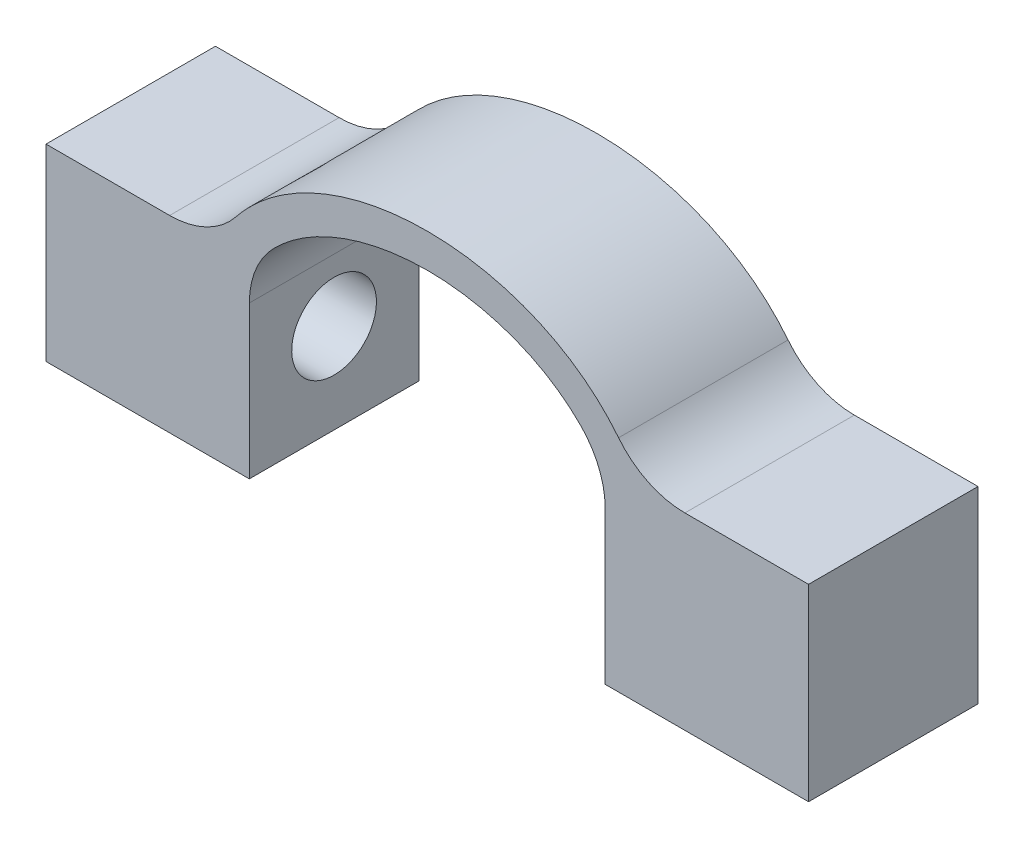
ISO-10303-21;
HEADER;
FILE_DESCRIPTION(('STEP AP214'),'2;1');
FILE_NAME('part.step','',(''),(''),'','','');
FILE_SCHEMA(('AUTOMOTIVE_DESIGN { 1 0 10303 214 1 1 1 1 }'));
ENDSEC;
DATA;
#1=APPLICATION_CONTEXT('core data for automotive mechanical design processes');
#2=APPLICATION_PROTOCOL_DEFINITION('international standard','automotive_design',2000,#1);
#3=PRODUCT_CONTEXT('',#1,'mechanical');
#4=PRODUCT('Part','Part','',(#3));
#5=PRODUCT_RELATED_PRODUCT_CATEGORY('part','',(#4));
#6=PRODUCT_DEFINITION_FORMATION('','',#4);
#7=PRODUCT_DEFINITION_CONTEXT('part definition',#1,'design');
#8=PRODUCT_DEFINITION('design','',#6,#7);
#9=PRODUCT_DEFINITION_SHAPE('','',#8);
#10=(LENGTH_UNIT() NAMED_UNIT(*) SI_UNIT(.MILLI.,.METRE.));
#11=(NAMED_UNIT(*) PLANE_ANGLE_UNIT() SI_UNIT($,.RADIAN.));
#12=(NAMED_UNIT(*) SI_UNIT($,.STERADIAN.) SOLID_ANGLE_UNIT());
#13=UNCERTAINTY_MEASURE_WITH_UNIT(LENGTH_MEASURE(1.E-05),#10,'distance_accuracy_value','');
#14=(GEOMETRIC_REPRESENTATION_CONTEXT(3) GLOBAL_UNCERTAINTY_ASSIGNED_CONTEXT((#13)) GLOBAL_UNIT_ASSIGNED_CONTEXT((#10,
#11,#12)) REPRESENTATION_CONTEXT('',''));
#15=CARTESIAN_POINT('',(0.,0.,0.));
#16=DIRECTION('',(0.,0.,1.));
#17=DIRECTION('',(1.,0.,0.));
#18=AXIS2_PLACEMENT_3D('',#15,#16,#17);
#19=CARTESIAN_POINT('',(0.,0.,-10.));
#20=DIRECTION('',(0.,-1.,0.));
#21=DIRECTION('',(0.,0.,-1.));
#22=AXIS2_PLACEMENT_3D('',#19,#20,#21);
#23=PLANE('',#22);
#24=CARTESIAN_POINT('',(41.5,0.,-5.));
#25=DIRECTION('',(0.,-1.,0.));
#26=DIRECTION('',(0.,0.,-1.));
#27=AXIS2_PLACEMENT_3D('',#24,#25,#26);
#28=CIRCLE('',#27,2.);
#29=CARTESIAN_POINT('',(41.5,0.,-7.));
#30=VERTEX_POINT('',#29);
#31=EDGE_CURVE('E561',#30,#30,#28,.T.);
#32=ORIENTED_EDGE('',*,*,#31,.F.);
#33=EDGE_LOOP('',(#32));
#34=FACE_BOUND('',#33,.T.);
#35=DIRECTION('',(1.,0.,0.));
#36=VECTOR('',#35,1.);
#37=CARTESIAN_POINT('',(0.,0.,0.));
#38=LINE('',#37,#36);
#39=CARTESIAN_POINT('',(33.,0.,0.));
#40=VERTEX_POINT('',#39);
#41=CARTESIAN_POINT('',(45.,0.,0.));
#42=VERTEX_POINT('',#41);
#43=EDGE_CURVE('E166',#40,#42,#38,.T.);
#44=ORIENTED_EDGE('',*,*,#43,.F.);
#45=DIRECTION('',(0.,0.,-1.));
#46=VECTOR('',#45,1.);
#47=CARTESIAN_POINT('',(33.,0.,62.9026152266645));
#48=LINE('',#47,#46);
#49=CARTESIAN_POINT('',(33.,0.,-9.99999999999999));
#50=VERTEX_POINT('',#49);
#51=EDGE_CURVE('E159',#40,#50,#48,.T.);
#52=ORIENTED_EDGE('',*,*,#51,.T.);
#53=DIRECTION('',(1.,0.,0.));
#54=VECTOR('',#53,1.);
#55=CARTESIAN_POINT('',(0.,0.,-10.));
#56=LINE('',#55,#54);
#57=CARTESIAN_POINT('',(45.,0.,-10.));
#58=VERTEX_POINT('',#57);
#59=EDGE_CURVE('E270',#50,#58,#56,.T.);
#60=ORIENTED_EDGE('',*,*,#59,.T.);
#61=DIRECTION('',(0.,0.,1.));
#62=VECTOR('',#61,1.);
#63=CARTESIAN_POINT('',(45.,0.,-10.));
#64=LINE('',#63,#62);
#65=EDGE_CURVE('E191',#58,#42,#64,.T.);
#66=ORIENTED_EDGE('',*,*,#65,.T.);
#67=EDGE_LOOP('',(#44,#52,#60,#66));
#68=FACE_BOUND('',#67,.T.);
#69=ADVANCED_FACE('F44',(#34,#68),#23,.T.);
#70=CARTESIAN_POINT('',(3.50000000000001,0.,-5.));
#71=DIRECTION('',(0.,-1.,0.));
#72=DIRECTION('',(0.,0.,-1.));
#73=AXIS2_PLACEMENT_3D('',#70,#71,#72);
#74=CIRCLE('',#73,2.);
#75=CARTESIAN_POINT('',(3.50000000000001,0.,-7.));
#76=VERTEX_POINT('',#75);
#77=EDGE_CURVE('E546',#76,#76,#74,.F.);
#78=ORIENTED_EDGE('',*,*,#77,.T.);
#79=EDGE_LOOP('',(#78));
#80=FACE_BOUND('',#79,.T.);
#81=CARTESIAN_POINT('',(0.,0.,-10.));
#82=VERTEX_POINT('',#81);
#83=CARTESIAN_POINT('',(12.,0.,-9.99999999999999));
#84=VERTEX_POINT('',#83);
#85=EDGE_CURVE('E158',#82,#84,#56,.T.);
#86=ORIENTED_EDGE('',*,*,#85,.T.);
#87=DIRECTION('',(0.,0.,-1.));
#88=VECTOR('',#87,1.);
#89=CARTESIAN_POINT('',(12.,0.,62.9026152266645));
#90=LINE('',#89,#88);
#91=CARTESIAN_POINT('',(12.,0.,0.));
#92=VERTEX_POINT('',#91);
#93=EDGE_CURVE('E144',#92,#84,#90,.T.);
#94=ORIENTED_EDGE('',*,*,#93,.F.);
#95=CARTESIAN_POINT('',(0.,0.,0.));
#96=VERTEX_POINT('',#95);
#97=EDGE_CURVE('E155',#96,#92,#38,.T.);
#98=ORIENTED_EDGE('',*,*,#97,.F.);
#99=DIRECTION('',(0.,0.,1.));
#100=VECTOR('',#99,1.);
#101=CARTESIAN_POINT('',(0.,0.,-10.));
#102=LINE('',#101,#100);
#103=EDGE_CURVE('E194',#82,#96,#102,.T.);
#104=ORIENTED_EDGE('',*,*,#103,.F.);
#105=EDGE_LOOP('',(#86,#94,#98,#104));
#106=FACE_BOUND('',#105,.T.);
#107=ADVANCED_FACE('F154',(#80,#106),#23,.T.);
#108=CARTESIAN_POINT('',(22.5,17.9146219807209,-10.));
#109=DIRECTION('',(0.,0.,1.));
#110=DIRECTION('',(1.,0.,0.));
#111=AXIS2_PLACEMENT_3D('',#108,#109,#110);
#112=PLANE('',#111);
#113=DIRECTION('',(0.,-1.,0.));
#114=VECTOR('',#113,1.);
#115=CARTESIAN_POINT('',(33.,17.9146219807209,-10.));
#116=LINE('',#115,#114);
#117=CARTESIAN_POINT('',(33.,8.98996848509808,-10.));
#118=VERTEX_POINT('',#117);
#119=EDGE_CURVE('E253',#118,#50,#116,.T.);
#120=ORIENTED_EDGE('',*,*,#119,.F.);
#121=CARTESIAN_POINT('',(27.9999999999997,8.98996848509808,-10.));
#122=DIRECTION('',(0.,0.,1.));
#123=DIRECTION('',(1.,0.,0.));
#124=AXIS2_PLACEMENT_3D('',#121,#122,#123);
#125=CIRCLE('',#124,5.);
#126=CARTESIAN_POINT('',(31.5519845757178,12.5089748184061,-9.99999999999999));
#127=VERTEX_POINT('',#126);
#128=EDGE_CURVE('E233',#118,#127,#125,.T.);
#129=ORIENTED_EDGE('',*,*,#128,.T.);
#130=CARTESIAN_POINT('',(33.,10.6109045973641,-9.99999999999999));
#131=CARTESIAN_POINT('',(32.5185180692616,11.4553673642236,-9.99999999999999));
#132=CARTESIAN_POINT('',(31.2713426798647,12.9823496363492,-9.99999999999999));
#133=CARTESIAN_POINT('',(27.9311574734115,15.2011361202542,-9.99999999999999));
#134=CARTESIAN_POINT('',(22.5,16.390279221032,-9.99999999999999));
#135=CARTESIAN_POINT('',(17.0688425265884,15.2011361202542,-9.99999999999999));
#136=CARTESIAN_POINT('',(13.7286573201353,12.9823496363492,-9.99999999999999));
#137=CARTESIAN_POINT('',(12.4814819307384,11.4553673642236,-9.99999999999999));
#138=CARTESIAN_POINT('',(12.,10.6109045973641,-9.99999999999999));
#139=B_SPLINE_CURVE_WITH_KNOTS('',3,(#130,#131,#132,#133,#134,#135,#136,#137,#138),
.UNSPECIFIED.,.F.,.F.,(4,1,1,1,1,1,4),(0.0183084592899443,0.138731344467458,0.259154229644972,
0.5,0.740845770355028,0.861268655532542,0.981691540710056),.UNSPECIFIED.);
#140=CARTESIAN_POINT('',(13.448015424282,12.5089748184059,-9.99999999999999));
#141=VERTEX_POINT('',#140);
#142=EDGE_CURVE('E251',#141,#127,#139,.F.);
#143=ORIENTED_EDGE('',*,*,#142,.F.);
#144=CARTESIAN_POINT('',(17.0000000000001,8.98996848509807,-10.));
#145=DIRECTION('',(0.,0.,1.));
#146=DIRECTION('',(1.,0.,0.));
#147=AXIS2_PLACEMENT_3D('',#144,#145,#146);
#148=CIRCLE('',#147,5.);
#149=CARTESIAN_POINT('',(12.,8.98996848509807,-10.));
#150=VERTEX_POINT('',#149);
#151=EDGE_CURVE('E52',#141,#150,#148,.T.);
#152=ORIENTED_EDGE('',*,*,#151,.T.);
#153=DIRECTION('',(0.,1.,0.));
#154=VECTOR('',#153,1.);
#155=CARTESIAN_POINT('',(12.,17.9146219807209,-10.));
#156=LINE('',#155,#154);
#157=EDGE_CURVE('E257',#84,#150,#156,.T.);
#158=ORIENTED_EDGE('',*,*,#157,.F.);
#159=ORIENTED_EDGE('',*,*,#85,.F.);
#160=DIRECTION('',(0.,-1.,0.));
#161=VECTOR('',#160,1.);
#162=CARTESIAN_POINT('',(0.,0.,-10.));
#163=LINE('',#162,#161);
#164=CARTESIAN_POINT('',(0.,11.1125,-10.));
#165=VERTEX_POINT('',#164);
#166=EDGE_CURVE('E186',#165,#82,#163,.T.);
#167=ORIENTED_EDGE('',*,*,#166,.F.);
#168=DIRECTION('',(-1.,0.,0.));
#169=VECTOR('',#168,1.);
#170=CARTESIAN_POINT('',(0.,11.1125,-10.));
#171=LINE('',#170,#169);
#172=CARTESIAN_POINT('',(7.29724409171739,11.1125,-10.));
#173=VERTEX_POINT('',#172);
#174=EDGE_CURVE('E195',#173,#165,#171,.T.);
#175=ORIENTED_EDGE('',*,*,#174,.F.);
#176=CARTESIAN_POINT('',(7.29724409171739,16.1125,-10.));
#177=DIRECTION('',(0.,0.,1.));
#178=DIRECTION('',(1.,0.,0.));
#179=AXIS2_PLACEMENT_3D('',#176,#177,#178);
#180=CIRCLE('',#179,5.);
#181=CARTESIAN_POINT('',(11.2089139312403,12.9982040817278,-10.));
#182=VERTEX_POINT('',#181);
#183=EDGE_CURVE('E227',#173,#182,#180,.T.);
#184=ORIENTED_EDGE('',*,*,#183,.T.);
#185=CARTESIAN_POINT('',(35.,11.1125,-10.));
#186=CARTESIAN_POINT('',(30.4233749031076,20.1819959742945,-10.));
#187=CARTESIAN_POINT('',(14.5766250968924,20.1819959742945,-10.));
#188=CARTESIAN_POINT('',(10.,11.1125,-10.));
#189=B_SPLINE_CURVE_WITH_KNOTS('',3,(#185,#186,#187,#188),.UNSPECIFIED.,.F.,.F.,(4,4),(0.,1.),.UNSPECIFIED.);
#190=CARTESIAN_POINT('',(33.7910860687597,12.9982040817278,-10.));
#191=VERTEX_POINT('',#190);
#192=EDGE_CURVE('E278',#191,#182,#189,.T.);
#193=ORIENTED_EDGE('',*,*,#192,.F.);
#194=CARTESIAN_POINT('',(37.7027559082826,16.1125,-10.));
#195=DIRECTION('',(0.,0.,1.));
#196=DIRECTION('',(1.,0.,0.));
#197=AXIS2_PLACEMENT_3D('',#194,#195,#196);
#198=CIRCLE('',#197,5.);
#199=CARTESIAN_POINT('',(37.7027559082826,11.1125,-10.));
#200=VERTEX_POINT('',#199);
#201=EDGE_CURVE('E231',#191,#200,#198,.T.);
#202=ORIENTED_EDGE('',*,*,#201,.T.);
#203=DIRECTION('',(-1.,0.,0.));
#204=VECTOR('',#203,1.);
#205=CARTESIAN_POINT('',(35.,11.1125,-10.));
#206=LINE('',#205,#204);
#207=CARTESIAN_POINT('',(45.,11.1125,-10.));
#208=VERTEX_POINT('',#207);
#209=EDGE_CURVE('E275',#208,#200,#206,.T.);
#210=ORIENTED_EDGE('',*,*,#209,.F.);
#211=DIRECTION('',(0.,1.,0.));
#212=VECTOR('',#211,1.);
#213=CARTESIAN_POINT('',(45.,11.1125,-10.));
#214=LINE('',#213,#212);
#215=EDGE_CURVE('E272',#58,#208,#214,.T.);
#216=ORIENTED_EDGE('',*,*,#215,.F.);
#217=ORIENTED_EDGE('',*,*,#59,.F.);
#218=EDGE_LOOP('',(#120,#129,#143,#152,#158,#159,#167,#175,#184,#193,#202,#210,#216,#217));
#219=FACE_BOUND('',#218,.T.);
#220=ADVANCED_FACE('F250',(#219),#112,.F.);
#221=CARTESIAN_POINT('',(22.5,17.9146219807209,0.));
#222=DIRECTION('',(0.,0.,1.));
#223=DIRECTION('',(1.,0.,0.));
#224=AXIS2_PLACEMENT_3D('',#221,#222,#223);
#225=PLANE('',#224);
#226=DIRECTION('',(0.,1.,0.));
#227=VECTOR('',#226,1.);
#228=CARTESIAN_POINT('',(12.,17.9146219807209,0.));
#229=LINE('',#228,#227);
#230=CARTESIAN_POINT('',(12.,8.98996848509807,0.));
#231=VERTEX_POINT('',#230);
#232=EDGE_CURVE('E141',#92,#231,#229,.T.);
#233=ORIENTED_EDGE('',*,*,#232,.T.);
#234=CARTESIAN_POINT('',(17.0000000000001,8.98996848509807,0.));
#235=DIRECTION('',(0.,0.,1.));
#236=DIRECTION('',(1.,0.,0.));
#237=AXIS2_PLACEMENT_3D('',#234,#235,#236);
#238=CIRCLE('',#237,5.);
#239=CARTESIAN_POINT('',(13.448015424282,12.5089748184059,0.));
#240=VERTEX_POINT('',#239);
#241=EDGE_CURVE('E13',#231,#240,#238,.F.);
#242=ORIENTED_EDGE('',*,*,#241,.T.);
#243=CARTESIAN_POINT('',(33.,10.6109045973641,0.));
#244=CARTESIAN_POINT('',(32.5185180692616,11.4553673642236,0.));
#245=CARTESIAN_POINT('',(31.2713426798647,12.9823496363492,0.));
#246=CARTESIAN_POINT('',(27.9311574734115,15.2011361202542,0.));
#247=CARTESIAN_POINT('',(22.5,16.390279221032,0.));
#248=CARTESIAN_POINT('',(17.0688425265884,15.2011361202542,0.));
#249=CARTESIAN_POINT('',(13.7286573201353,12.9823496363492,0.));
#250=CARTESIAN_POINT('',(12.4814819307384,11.4553673642236,0.));
#251=CARTESIAN_POINT('',(12.,10.6109045973641,0.));
#252=B_SPLINE_CURVE_WITH_KNOTS('',3,(#243,#244,#245,#246,#247,#248,#249,#250,#251),
.UNSPECIFIED.,.F.,.F.,(4,1,1,1,1,1,4),(0.0183084592899443,0.138731344467458,0.259154229644972,
0.5,0.740845770355028,0.861268655532542,0.981691540710056),.UNSPECIFIED.);
#253=CARTESIAN_POINT('',(31.5519845757178,12.5089748184061,0.));
#254=VERTEX_POINT('',#253);
#255=EDGE_CURVE('E148',#240,#254,#252,.F.);
#256=ORIENTED_EDGE('',*,*,#255,.T.);
#257=CARTESIAN_POINT('',(27.9999999999997,8.98996848509808,0.));
#258=DIRECTION('',(0.,0.,1.));
#259=DIRECTION('',(1.,0.,0.));
#260=AXIS2_PLACEMENT_3D('',#257,#258,#259);
#261=CIRCLE('',#260,5.);
#262=CARTESIAN_POINT('',(33.,8.98996848509808,0.));
#263=VERTEX_POINT('',#262);
#264=EDGE_CURVE('E235',#254,#263,#261,.F.);
#265=ORIENTED_EDGE('',*,*,#264,.T.);
#266=DIRECTION('',(0.,-1.,0.));
#267=VECTOR('',#266,1.);
#268=CARTESIAN_POINT('',(33.,17.9146219807209,0.));
#269=LINE('',#268,#267);
#270=EDGE_CURVE('E201',#263,#40,#269,.T.);
#271=ORIENTED_EDGE('',*,*,#270,.T.);
#272=ORIENTED_EDGE('',*,*,#43,.T.);
#273=DIRECTION('',(0.,1.,0.));
#274=VECTOR('',#273,1.);
#275=CARTESIAN_POINT('',(45.,11.1125,0.));
#276=LINE('',#275,#274);
#277=CARTESIAN_POINT('',(45.,11.1125,0.));
#278=VERTEX_POINT('',#277);
#279=EDGE_CURVE('E165',#42,#278,#276,.T.);
#280=ORIENTED_EDGE('',*,*,#279,.T.);
#281=DIRECTION('',(-1.,0.,0.));
#282=VECTOR('',#281,1.);
#283=CARTESIAN_POINT('',(35.,11.1125,0.));
#284=LINE('',#283,#282);
#285=CARTESIAN_POINT('',(37.7027559082826,11.1125,0.));
#286=VERTEX_POINT('',#285);
#287=EDGE_CURVE('E169',#278,#286,#284,.T.);
#288=ORIENTED_EDGE('',*,*,#287,.T.);
#289=CARTESIAN_POINT('',(37.7027559082826,16.1125,0.));
#290=DIRECTION('',(0.,0.,1.));
#291=DIRECTION('',(1.,0.,0.));
#292=AXIS2_PLACEMENT_3D('',#289,#290,#291);
#293=CIRCLE('',#292,5.);
#294=CARTESIAN_POINT('',(33.7910860687597,12.9982040817278,0.));
#295=VERTEX_POINT('',#294);
#296=EDGE_CURVE('E229',#286,#295,#293,.F.);
#297=ORIENTED_EDGE('',*,*,#296,.T.);
#298=CARTESIAN_POINT('',(35.,11.1125,0.));
#299=CARTESIAN_POINT('',(30.4233749031076,20.1819959742945,0.));
#300=CARTESIAN_POINT('',(14.5766250968924,20.1819959742945,0.));
#301=CARTESIAN_POINT('',(10.,11.1125,0.));
#302=B_SPLINE_CURVE_WITH_KNOTS('',3,(#298,#299,#300,#301),.UNSPECIFIED.,.F.,.F.,(4,4),(0.,1.),.UNSPECIFIED.);
#303=CARTESIAN_POINT('',(11.2089139312403,12.9982040817278,0.));
#304=VERTEX_POINT('',#303);
#305=EDGE_CURVE('E176',#295,#304,#302,.T.);
#306=ORIENTED_EDGE('',*,*,#305,.T.);
#307=CARTESIAN_POINT('',(7.29724409171739,16.1125,0.));
#308=DIRECTION('',(0.,0.,1.));
#309=DIRECTION('',(1.,0.,0.));
#310=AXIS2_PLACEMENT_3D('',#307,#308,#309);
#311=CIRCLE('',#310,5.);
#312=CARTESIAN_POINT('',(7.29724409171739,11.1125,0.));
#313=VERTEX_POINT('',#312);
#314=EDGE_CURVE('E225',#304,#313,#311,.F.);
#315=ORIENTED_EDGE('',*,*,#314,.T.);
#316=DIRECTION('',(-1.,0.,0.));
#317=VECTOR('',#316,1.);
#318=CARTESIAN_POINT('',(0.,11.1125,0.));
#319=LINE('',#318,#317);
#320=CARTESIAN_POINT('',(0.,11.1125,0.));
#321=VERTEX_POINT('',#320);
#322=EDGE_CURVE('E181',#313,#321,#319,.T.);
#323=ORIENTED_EDGE('',*,*,#322,.T.);
#324=DIRECTION('',(0.,-1.,0.));
#325=VECTOR('',#324,1.);
#326=CARTESIAN_POINT('',(0.,0.,0.));
#327=LINE('',#326,#325);
#328=EDGE_CURVE('E164',#321,#96,#327,.T.);
#329=ORIENTED_EDGE('',*,*,#328,.T.);
#330=ORIENTED_EDGE('',*,*,#97,.T.);
#331=EDGE_LOOP('',(#233,#242,#256,#265,#271,#272,#280,#288,#297,#306,#315,#323,#329,#330));
#332=FACE_BOUND('',#331,.T.);
#333=ADVANCED_FACE('F162',(#332),#225,.T.);
#334=CARTESIAN_POINT('',(0.,0.,-10.));
#335=DIRECTION('',(-1.,0.,0.));
#336=DIRECTION('',(0.,0.,1.));
#337=AXIS2_PLACEMENT_3D('',#334,#335,#336);
#338=PLANE('',#337);
#339=ORIENTED_EDGE('',*,*,#328,.F.);
#340=DIRECTION('',(0.,0.,1.));
#341=VECTOR('',#340,1.);
#342=CARTESIAN_POINT('',(0.,11.1125,-10.));
#343=LINE('',#342,#341);
#344=EDGE_CURVE('E149',#165,#321,#343,.T.);
#345=ORIENTED_EDGE('',*,*,#344,.F.);
#346=ORIENTED_EDGE('',*,*,#166,.T.);
#347=ORIENTED_EDGE('',*,*,#103,.T.);
#348=EDGE_LOOP('',(#339,#345,#346,#347));
#349=FACE_BOUND('',#348,.T.);
#350=ADVANCED_FACE('F305',(#349),#338,.T.);
#351=CARTESIAN_POINT('',(0.,11.1125,-10.));
#352=DIRECTION('',(0.,1.,0.));
#353=DIRECTION('',(-1.,0.,0.));
#354=AXIS2_PLACEMENT_3D('',#351,#352,#353);
#355=PLANE('',#354);
#356=ORIENTED_EDGE('',*,*,#322,.F.);
#357=DIRECTION('',(0.,0.,-1.));
#358=VECTOR('',#357,1.);
#359=CARTESIAN_POINT('',(7.29724409171739,11.1125,-10.));
#360=LINE('',#359,#358);
#361=EDGE_CURVE('E211',#313,#173,#360,.T.);
#362=ORIENTED_EDGE('',*,*,#361,.T.);
#363=ORIENTED_EDGE('',*,*,#174,.T.);
#364=ORIENTED_EDGE('',*,*,#344,.T.);
#365=EDGE_LOOP('',(#356,#362,#363,#364));
#366=FACE_BOUND('',#365,.T.);
#367=ADVANCED_FACE('F292',(#366),#355,.T.);
#368=DIRECTION('',(0.,0.,1.));
#369=VECTOR('',#368,1.);
#370=SURFACE_OF_LINEAR_EXTRUSION('',#189,#369);
#371=ORIENTED_EDGE('',*,*,#192,.T.);
#372=DIRECTION('',(0.,0.,1.));
#373=VECTOR('',#372,1.);
#374=CARTESIAN_POINT('',(11.2089139312404,12.9982040817279,-10.));
#375=LINE('',#374,#373);
#376=EDGE_CURVE('E208',#182,#304,#375,.T.);
#377=ORIENTED_EDGE('',*,*,#376,.T.);
#378=ORIENTED_EDGE('',*,*,#305,.F.);
#379=DIRECTION('',(0.,0.,1.));
#380=VECTOR('',#379,1.);
#381=CARTESIAN_POINT('',(33.7910860687596,12.9982040817279,0.));
#382=LINE('',#381,#380);
#383=EDGE_CURVE('E206',#295,#191,#382,.F.);
#384=ORIENTED_EDGE('',*,*,#383,.T.);
#385=EDGE_LOOP('',(#371,#377,#378,#384));
#386=FACE_BOUND('',#385,.T.);
#387=ADVANCED_FACE('F287',(#386),#370,.T.);
#388=CARTESIAN_POINT('',(35.,11.1125,-10.));
#389=DIRECTION('',(0.,1.,0.));
#390=DIRECTION('',(-1.,0.,0.));
#391=AXIS2_PLACEMENT_3D('',#388,#389,#390);
#392=PLANE('',#391);
#393=ORIENTED_EDGE('',*,*,#209,.T.);
#394=DIRECTION('',(0.,0.,-1.));
#395=VECTOR('',#394,1.);
#396=CARTESIAN_POINT('',(37.7027559082826,11.1125,0.));
#397=LINE('',#396,#395);
#398=EDGE_CURVE('E213',#200,#286,#397,.F.);
#399=ORIENTED_EDGE('',*,*,#398,.T.);
#400=ORIENTED_EDGE('',*,*,#287,.F.);
#401=DIRECTION('',(0.,0.,1.));
#402=VECTOR('',#401,1.);
#403=CARTESIAN_POINT('',(45.,11.1125,-10.));
#404=LINE('',#403,#402);
#405=EDGE_CURVE('E189',#208,#278,#404,.T.);
#406=ORIENTED_EDGE('',*,*,#405,.F.);
#407=EDGE_LOOP('',(#393,#399,#400,#406));
#408=FACE_BOUND('',#407,.T.);
#409=ADVANCED_FACE('F291',(#408),#392,.T.);
#410=CARTESIAN_POINT('',(45.,11.1125,-10.));
#411=DIRECTION('',(1.,0.,0.));
#412=DIRECTION('',(0.,0.,-1.));
#413=AXIS2_PLACEMENT_3D('',#410,#411,#412);
#414=PLANE('',#413);
#415=ORIENTED_EDGE('',*,*,#279,.F.);
#416=ORIENTED_EDGE('',*,*,#65,.F.);
#417=ORIENTED_EDGE('',*,*,#215,.T.);
#418=ORIENTED_EDGE('',*,*,#405,.T.);
#419=EDGE_LOOP('',(#415,#416,#417,#418));
#420=FACE_BOUND('',#419,.T.);
#421=ADVANCED_FACE('F297',(#420),#414,.T.);
#422=CARTESIAN_POINT('',(33.,10.6109045973641,62.9026152266645));
#423=DIRECTION('',(-1.,0.,0.));
#424=DIRECTION('',(0.,0.,1.));
#425=AXIS2_PLACEMENT_3D('',#422,#423,#424);
#426=PLANE('',#425);
#427=CARTESIAN_POINT('',(33.,5.30545229868207,-5.));
#428=DIRECTION('',(1.,0.,0.));
#429=DIRECTION('',(0.,1.,0.));
#430=AXIS2_PLACEMENT_3D('',#427,#428,#429);
#431=CIRCLE('',#430,2.5);
#432=CARTESIAN_POINT('',(33.,7.80545229868207,-5.));
#433=VERTEX_POINT('',#432);
#434=EDGE_CURVE('E553',#433,#433,#431,.T.);
#435=ORIENTED_EDGE('',*,*,#434,.T.);
#436=EDGE_LOOP('',(#435));
#437=FACE_BOUND('',#436,.T.);
#438=ORIENTED_EDGE('',*,*,#270,.F.);
#439=DIRECTION('',(0.,0.,1.));
#440=VECTOR('',#439,1.);
#441=CARTESIAN_POINT('',(33.,8.98996848509808,-9.99999999999999));
#442=LINE('',#441,#440);
#443=EDGE_CURVE('E216',#263,#118,#442,.F.);
#444=ORIENTED_EDGE('',*,*,#443,.T.);
#445=ORIENTED_EDGE('',*,*,#119,.T.);
#446=ORIENTED_EDGE('',*,*,#51,.F.);
#447=EDGE_LOOP('',(#438,#444,#445,#446));
#448=FACE_BOUND('',#447,.T.);
#449=ADVANCED_FACE('F244',(#437,#448),#426,.T.);
#450=CARTESIAN_POINT('',(33.,10.6109045973641,62.9026152266645));
#451=CARTESIAN_POINT('',(32.5185180692616,11.4553673642236,62.9026152266645));
#452=CARTESIAN_POINT('',(31.2713426798647,12.9823496363492,62.9026152266645));
#453=CARTESIAN_POINT('',(27.9311574734115,15.2011361202542,62.9026152266645));
#454=CARTESIAN_POINT('',(22.5,16.390279221032,62.9026152266645));
#455=CARTESIAN_POINT('',(17.0688425265884,15.2011361202542,62.9026152266645));
#456=CARTESIAN_POINT('',(13.7286573201353,12.9823496363492,62.9026152266645));
#457=CARTESIAN_POINT('',(12.4814819307384,11.4553673642236,62.9026152266645));
#458=CARTESIAN_POINT('',(12.,10.6109045973641,62.9026152266645));
#459=B_SPLINE_CURVE_WITH_KNOTS('',3,(#450,#451,#452,#453,#454,#455,#456,#457,#458),
.UNSPECIFIED.,.F.,.F.,(4,1,1,1,1,1,4),(0.0183084592899443,0.138731344467458,0.259154229644972,
0.5,0.740845770355028,0.861268655532542,0.981691540710056),.UNSPECIFIED.);
#460=DIRECTION('',(0.,0.,-1.));
#461=VECTOR('',#460,1.);
#462=SURFACE_OF_LINEAR_EXTRUSION('',#459,#461);
#463=ORIENTED_EDGE('',*,*,#142,.T.);
#464=DIRECTION('',(0.,0.,-1.));
#465=VECTOR('',#464,1.);
#466=CARTESIAN_POINT('',(31.5519845757178,12.5089748184061,-9.99999999999999));
#467=LINE('',#466,#465);
#468=EDGE_CURVE('E222',#127,#254,#467,.F.);
#469=ORIENTED_EDGE('',*,*,#468,.T.);
#470=ORIENTED_EDGE('',*,*,#255,.F.);
#471=DIRECTION('',(0.,0.,-1.));
#472=VECTOR('',#471,1.);
#473=CARTESIAN_POINT('',(13.448015424282,12.5089748184059,0.));
#474=LINE('',#473,#472);
#475=EDGE_CURVE('E219',#240,#141,#474,.T.);
#476=ORIENTED_EDGE('',*,*,#475,.T.);
#477=EDGE_LOOP('',(#463,#469,#470,#476));
#478=FACE_BOUND('',#477,.T.);
#479=ADVANCED_FACE('F255',(#478),#462,.T.);
#480=CARTESIAN_POINT('',(12.,10.6109045973641,62.9026152266645));
#481=DIRECTION('',(1.,0.,0.));
#482=DIRECTION('',(0.,1.,0.));
#483=AXIS2_PLACEMENT_3D('',#480,#481,#482);
#484=PLANE('',#483);
#485=CARTESIAN_POINT('',(12.,5.30545229868206,-5.));
#486=DIRECTION('',(1.,0.,0.));
#487=DIRECTION('',(0.,1.,0.));
#488=AXIS2_PLACEMENT_3D('',#485,#486,#487);
#489=CIRCLE('',#488,2.5);
#490=CARTESIAN_POINT('',(12.,7.80545229868206,-5.));
#491=VERTEX_POINT('',#490);
#492=EDGE_CURVE('E517',#491,#491,#489,.T.);
#493=ORIENTED_EDGE('',*,*,#492,.F.);
#494=EDGE_LOOP('',(#493));
#495=FACE_BOUND('',#494,.T.);
#496=ORIENTED_EDGE('',*,*,#157,.T.);
#497=DIRECTION('',(0.,0.,1.));
#498=VECTOR('',#497,1.);
#499=CARTESIAN_POINT('',(12.,8.98996848509807,0.));
#500=LINE('',#499,#498);
#501=EDGE_CURVE('E59',#150,#231,#500,.T.);
#502=ORIENTED_EDGE('',*,*,#501,.T.);
#503=ORIENTED_EDGE('',*,*,#232,.F.);
#504=ORIENTED_EDGE('',*,*,#93,.T.);
#505=EDGE_LOOP('',(#496,#502,#503,#504));
#506=FACE_BOUND('',#505,.T.);
#507=ADVANCED_FACE('F143',(#495,#506),#484,.T.);
#508=CARTESIAN_POINT('',(6.,5.30545229868206,-5.));
#509=DIRECTION('',(1.,0.,0.));
#510=DIRECTION('',(0.,1.,0.));
#511=AXIS2_PLACEMENT_3D('',#508,#509,#510);
#512=CYLINDRICAL_SURFACE('',#511,2.5);
#513=CARTESIAN_POINT('',(6.,5.30545229868206,-5.));
#514=DIRECTION('',(1.,0.,0.));
#515=DIRECTION('',(0.,1.,0.));
#516=AXIS2_PLACEMENT_3D('',#513,#514,#515);
#517=CIRCLE('',#516,2.5);
#518=CARTESIAN_POINT('',(6.,7.80545229868206,-5.));
#519=VERTEX_POINT('',#518);
#520=EDGE_CURVE('E160',#519,#519,#517,.T.);
#521=ORIENTED_EDGE('',*,*,#520,.F.);
#522=EDGE_LOOP('',(#521));
#523=FACE_BOUND('',#522,.T.);
#524=ORIENTED_EDGE('',*,*,#492,.T.);
#525=EDGE_LOOP('',(#524));
#526=FACE_BOUND('',#525,.T.);
#527=ADVANCED_FACE('F351',(#523,#526),#512,.F.);
#528=CARTESIAN_POINT('',(6.,5.30545229868206,-5.));
#529=DIRECTION('',(1.,0.,0.));
#530=DIRECTION('',(0.,1.,0.));
#531=AXIS2_PLACEMENT_3D('',#528,#529,#530);
#532=PLANE('',#531);
#533=CARTESIAN_POINT('',(6.,5.30545229868206,-5.));
#534=DIRECTION('',(1.,0.,0.));
#535=DIRECTION('',(0.,1.,0.));
#536=AXIS2_PLACEMENT_3D('',#533,#534,#535);
#537=CIRCLE('',#536,2.);
#538=CARTESIAN_POINT('',(6.,7.30545229868206,-5.));
#539=VERTEX_POINT('',#538);
#540=EDGE_CURVE('E541',#539,#539,#537,.T.);
#541=ORIENTED_EDGE('',*,*,#540,.F.);
#542=EDGE_LOOP('',(#541));
#543=FACE_BOUND('',#542,.T.);
#544=ORIENTED_EDGE('',*,*,#520,.T.);
#545=EDGE_LOOP('',(#544));
#546=FACE_BOUND('',#545,.T.);
#547=ADVANCED_FACE('F479',(#543,#546),#532,.T.);
#548=CARTESIAN_POINT('',(6.,2.80545229868206,-5.));
#549=DIRECTION('',(0.,0.,-1.));
#550=DIRECTION('',(-1.,0.,0.));
#551=AXIS2_PLACEMENT_3D('',#548,#549,#550);
#552=TOROIDAL_SURFACE('',#551,2.5,2.);
#553=CARTESIAN_POINT('',(3.5,2.80545229868205,-5.));
#554=DIRECTION('',(0.,1.,0.));
#555=DIRECTION('',(-1.,0.,0.));
#556=AXIS2_PLACEMENT_3D('',#553,#554,#555);
#557=CIRCLE('',#556,2.);
#558=CARTESIAN_POINT('',(1.5,2.80545229868204,-5.));
#559=VERTEX_POINT('',#558);
#560=EDGE_CURVE('E549',#559,#559,#557,.T.);
#561=CARTESIAN_POINT('',(6.,2.80545229868206,-5.));
#562=DIRECTION('',(0.,0.,-1.));
#563=DIRECTION('',(-1.,0.,0.));
#564=AXIS2_PLACEMENT_3D('',#561,#562,#563);
#565=CIRCLE('',#564,4.5);
#566=EDGE_CURVE('',#559,#539,#565,.T.);
#567=ORIENTED_EDGE('',*,*,#560,.F.);
#568=ORIENTED_EDGE('',*,*,#540,.T.);
#569=ORIENTED_EDGE('',*,*,#566,.T.);
#570=ORIENTED_EDGE('',*,*,#566,.F.);
#571=EDGE_LOOP('',(#567,#569,#568,#570));
#572=FACE_BOUND('',#571,.T.);
#573=ADVANCED_FACE('F463',(#572),#552,.F.);
#574=CARTESIAN_POINT('',(3.50000000000003,-5.65685424949237,-5.));
#575=DIRECTION('',(0.,1.,0.));
#576=DIRECTION('',(-1.,0.,0.));
#577=AXIS2_PLACEMENT_3D('',#574,#575,#576);
#578=CYLINDRICAL_SURFACE('',#577,2.);
#579=ORIENTED_EDGE('',*,*,#560,.T.);
#580=EDGE_LOOP('',(#579));
#581=FACE_BOUND('',#580,.T.);
#582=ORIENTED_EDGE('',*,*,#77,.F.);
#583=EDGE_LOOP('',(#582));
#584=FACE_BOUND('',#583,.T.);
#585=ADVANCED_FACE('F448',(#581,#584),#578,.F.);
#586=CARTESIAN_POINT('',(39.,5.30545229868207,-5.));
#587=DIRECTION('',(-1.,0.,0.));
#588=DIRECTION('',(0.,0.,1.));
#589=AXIS2_PLACEMENT_3D('',#586,#587,#588);
#590=CYLINDRICAL_SURFACE('',#589,2.5);
#591=CARTESIAN_POINT('',(39.,5.30545229868207,-5.));
#592=DIRECTION('',(1.,0.,0.));
#593=DIRECTION('',(0.,1.,0.));
#594=AXIS2_PLACEMENT_3D('',#591,#592,#593);
#595=CIRCLE('',#594,2.5);
#596=CARTESIAN_POINT('',(39.,7.80545229868207,-5.));
#597=VERTEX_POINT('',#596);
#598=EDGE_CURVE('E552',#597,#597,#595,.T.);
#599=ORIENTED_EDGE('',*,*,#598,.T.);
#600=EDGE_LOOP('',(#599));
#601=FACE_BOUND('',#600,.T.);
#602=ORIENTED_EDGE('',*,*,#434,.F.);
#603=EDGE_LOOP('',(#602));
#604=FACE_BOUND('',#603,.T.);
#605=ADVANCED_FACE('F438',(#601,#604),#590,.F.);
#606=CARTESIAN_POINT('',(39.,5.30545229868207,-5.));
#607=DIRECTION('',(-1.,0.,0.));
#608=DIRECTION('',(0.,1.,0.));
#609=AXIS2_PLACEMENT_3D('',#606,#607,#608);
#610=PLANE('',#609);
#611=CARTESIAN_POINT('',(39.,5.30545229868207,-5.));
#612=DIRECTION('',(1.,0.,0.));
#613=DIRECTION('',(0.,1.,0.));
#614=AXIS2_PLACEMENT_3D('',#611,#612,#613);
#615=CIRCLE('',#614,2.);
#616=CARTESIAN_POINT('',(39.,7.30545229868207,-5.));
#617=VERTEX_POINT('',#616);
#618=EDGE_CURVE('E556',#617,#617,#615,.T.);
#619=ORIENTED_EDGE('',*,*,#618,.T.);
#620=EDGE_LOOP('',(#619));
#621=FACE_BOUND('',#620,.T.);
#622=ORIENTED_EDGE('',*,*,#598,.F.);
#623=EDGE_LOOP('',(#622));
#624=FACE_BOUND('',#623,.T.);
#625=ADVANCED_FACE('F428',(#621,#624),#610,.T.);
#626=CARTESIAN_POINT('',(39.,2.80545229868206,-5.));
#627=DIRECTION('',(0.,0.,-1.));
#628=DIRECTION('',(1.,0.,0.));
#629=AXIS2_PLACEMENT_3D('',#626,#627,#628);
#630=TOROIDAL_SURFACE('',#629,2.5,2.);
#631=CARTESIAN_POINT('',(41.5,2.80545229868206,-5.));
#632=DIRECTION('',(0.,-1.,0.));
#633=DIRECTION('',(1.,0.,0.));
#634=AXIS2_PLACEMENT_3D('',#631,#632,#633);
#635=CIRCLE('',#634,2.);
#636=CARTESIAN_POINT('',(43.5,2.80545229868205,-5.));
#637=VERTEX_POINT('',#636);
#638=EDGE_CURVE('E564',#637,#637,#635,.T.);
#639=CARTESIAN_POINT('',(39.,2.80545229868206,-5.));
#640=DIRECTION('',(0.,0.,-1.));
#641=DIRECTION('',(1.,0.,0.));
#642=AXIS2_PLACEMENT_3D('',#639,#640,#641);
#643=CIRCLE('',#642,4.5);
#644=EDGE_CURVE('',#617,#637,#643,.T.);
#645=ORIENTED_EDGE('',*,*,#618,.F.);
#646=ORIENTED_EDGE('',*,*,#638,.T.);
#647=ORIENTED_EDGE('',*,*,#644,.T.);
#648=ORIENTED_EDGE('',*,*,#644,.F.);
#649=EDGE_LOOP('',(#645,#647,#646,#648));
#650=FACE_BOUND('',#649,.T.);
#651=ADVANCED_FACE('F418',(#650),#630,.F.);
#652=CARTESIAN_POINT('',(41.5,-5.65685424949238,-5.));
#653=DIRECTION('',(0.,1.,0.));
#654=DIRECTION('',(-1.,0.,0.));
#655=AXIS2_PLACEMENT_3D('',#652,#653,#654);
#656=CYLINDRICAL_SURFACE('',#655,2.);
#657=ORIENTED_EDGE('',*,*,#638,.F.);
#658=EDGE_LOOP('',(#657));
#659=FACE_BOUND('',#658,.T.);
#660=ORIENTED_EDGE('',*,*,#31,.T.);
#661=EDGE_LOOP('',(#660));
#662=FACE_BOUND('',#661,.T.);
#663=ADVANCED_FACE('F313',(#659,#662),#656,.F.);
#664=CARTESIAN_POINT('',(7.29724409171739,16.1125,-5.));
#665=DIRECTION('',(0.,0.,1.));
#666=DIRECTION('',(1.,0.,0.));
#667=AXIS2_PLACEMENT_3D('',#664,#665,#666);
#668=CYLINDRICAL_SURFACE('',#667,5.);
#669=ORIENTED_EDGE('',*,*,#183,.F.);
#670=ORIENTED_EDGE('',*,*,#361,.F.);
#671=ORIENTED_EDGE('',*,*,#314,.F.);
#672=ORIENTED_EDGE('',*,*,#376,.F.);
#673=EDGE_LOOP('',(#669,#670,#671,#672));
#674=FACE_BOUND('',#673,.T.);
#675=ADVANCED_FACE('F309',(#674),#668,.F.);
#676=CARTESIAN_POINT('',(37.7027559082826,16.1125,-5.));
#677=DIRECTION('',(0.,0.,1.));
#678=DIRECTION('',(1.,0.,0.));
#679=AXIS2_PLACEMENT_3D('',#676,#677,#678);
#680=CYLINDRICAL_SURFACE('',#679,5.);
#681=ORIENTED_EDGE('',*,*,#201,.F.);
#682=ORIENTED_EDGE('',*,*,#383,.F.);
#683=ORIENTED_EDGE('',*,*,#296,.F.);
#684=ORIENTED_EDGE('',*,*,#398,.F.);
#685=EDGE_LOOP('',(#681,#682,#683,#684));
#686=FACE_BOUND('',#685,.T.);
#687=ADVANCED_FACE('F312',(#686),#680,.F.);
#688=CARTESIAN_POINT('',(27.9999999999997,8.98996848509808,-5.));
#689=DIRECTION('',(0.,0.,-1.));
#690=DIRECTION('',(-1.,0.,0.));
#691=AXIS2_PLACEMENT_3D('',#688,#689,#690);
#692=CYLINDRICAL_SURFACE('',#691,5.);
#693=ORIENTED_EDGE('',*,*,#264,.F.);
#694=ORIENTED_EDGE('',*,*,#468,.F.);
#695=ORIENTED_EDGE('',*,*,#128,.F.);
#696=ORIENTED_EDGE('',*,*,#443,.F.);
#697=EDGE_LOOP('',(#693,#694,#695,#696));
#698=FACE_BOUND('',#697,.T.);
#699=ADVANCED_FACE('F248',(#698),#692,.F.);
#700=CARTESIAN_POINT('',(17.0000000000001,8.98996848509807,-5.));
#701=DIRECTION('',(0.,0.,-1.));
#702=DIRECTION('',(-1.,0.,0.));
#703=AXIS2_PLACEMENT_3D('',#700,#701,#702);
#704=CYLINDRICAL_SURFACE('',#703,5.);
#705=ORIENTED_EDGE('',*,*,#241,.F.);
#706=ORIENTED_EDGE('',*,*,#501,.F.);
#707=ORIENTED_EDGE('',*,*,#151,.F.);
#708=ORIENTED_EDGE('',*,*,#475,.F.);
#709=EDGE_LOOP('',(#705,#706,#707,#708));
#710=FACE_BOUND('',#709,.T.);
#711=ADVANCED_FACE('F46',(#710),#704,.F.);
#712=CLOSED_SHELL('',(#69,#107,#220,#333,#350,#367,#387,#409,#421,#449,#479,#507,#527,#547,#573,
#585,#605,#625,#651,#663,#675,#687,#699,#711));
#713=MANIFOLD_SOLID_BREP('B2',#712);
#714=ADVANCED_BREP_SHAPE_REPRESENTATION('',(#18,#713),#14);
#715=SHAPE_DEFINITION_REPRESENTATION(#9,#714);
ENDSEC;
END-ISO-10303-21;
